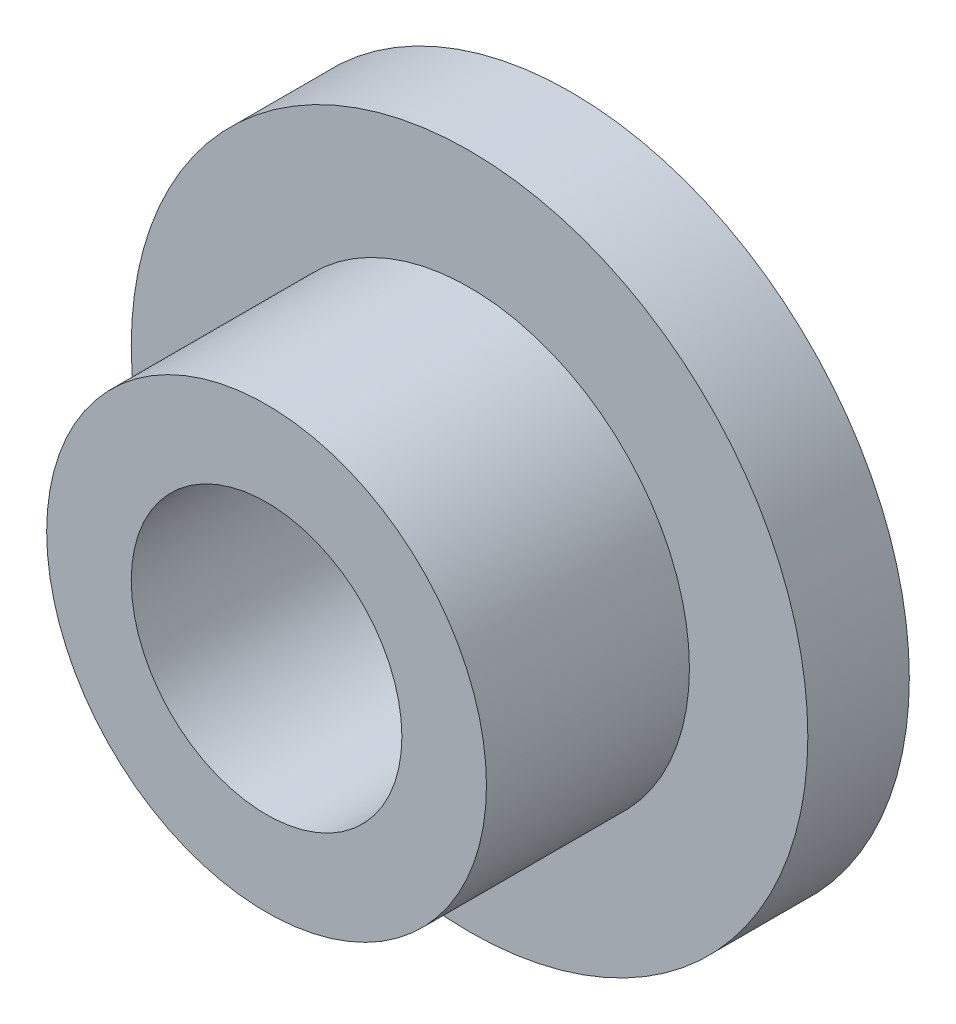
ISO-10303-21;
HEADER;
FILE_DESCRIPTION(('STEP AP214'),'2;1');
FILE_NAME('part.step','',(''),(''),'','','');
FILE_SCHEMA(('AUTOMOTIVE_DESIGN { 1 0 10303 214 1 1 1 1 }'));
ENDSEC;
DATA;
#1=APPLICATION_CONTEXT('core data for automotive mechanical design processes');
#2=APPLICATION_PROTOCOL_DEFINITION('international standard','automotive_design',2000,#1);
#3=PRODUCT_CONTEXT('',#1,'mechanical');
#4=PRODUCT('Part','Part','',(#3));
#5=PRODUCT_RELATED_PRODUCT_CATEGORY('part','',(#4));
#6=PRODUCT_DEFINITION_FORMATION('','',#4);
#7=PRODUCT_DEFINITION_CONTEXT('part definition',#1,'design');
#8=PRODUCT_DEFINITION('design','',#6,#7);
#9=PRODUCT_DEFINITION_SHAPE('','',#8);
#10=(LENGTH_UNIT() NAMED_UNIT(*) SI_UNIT(.MILLI.,.METRE.));
#11=(NAMED_UNIT(*) PLANE_ANGLE_UNIT() SI_UNIT($,.RADIAN.));
#12=(NAMED_UNIT(*) SI_UNIT($,.STERADIAN.) SOLID_ANGLE_UNIT());
#13=UNCERTAINTY_MEASURE_WITH_UNIT(LENGTH_MEASURE(1.E-05),#10,'distance_accuracy_value','');
#14=(GEOMETRIC_REPRESENTATION_CONTEXT(3) GLOBAL_UNCERTAINTY_ASSIGNED_CONTEXT((#13)) GLOBAL_UNIT_ASSIGNED_CONTEXT((#10,
#11,#12)) REPRESENTATION_CONTEXT('',''));
#15=CARTESIAN_POINT('',(0.,0.,0.));
#16=DIRECTION('',(0.,0.,1.));
#17=DIRECTION('',(1.,0.,0.));
#18=AXIS2_PLACEMENT_3D('',#15,#16,#17);
#19=CARTESIAN_POINT('',(-25.8191735710848,38.9768502607631,1.2));
#20=DIRECTION('',(0.,0.,1.));
#21=DIRECTION('',(1.,0.,0.));
#22=AXIS2_PLACEMENT_3D('',#19,#20,#21);
#23=PLANE('',#22);
#24=CARTESIAN_POINT('',(-25.8191735710848,38.9768502607631,1.2));
#25=DIRECTION('',(0.,0.,1.));
#26=DIRECTION('',(1.,0.,0.));
#27=AXIS2_PLACEMENT_3D('',#24,#25,#26);
#28=CIRCLE('',#27,1.29999999999999);
#29=CARTESIAN_POINT('',(-24.5191735710848,38.9768502607631,1.2));
#30=VERTEX_POINT('',#29);
#31=EDGE_CURVE('E10',#30,#30,#28,.T.);
#32=ORIENTED_EDGE('',*,*,#31,.T.);
#33=EDGE_LOOP('',(#32));
#34=FACE_BOUND('',#33,.T.);
#35=CARTESIAN_POINT('',(-25.8191735710848,38.9768502607631,1.2));
#36=DIRECTION('',(0.,0.,1.));
#37=DIRECTION('',(1.,0.,0.));
#38=AXIS2_PLACEMENT_3D('',#35,#36,#37);
#39=CIRCLE('',#38,0.8);
#40=CARTESIAN_POINT('',(-25.0191735710848,38.9768502607631,1.2));
#41=VERTEX_POINT('',#40);
#42=EDGE_CURVE('E45',#41,#41,#39,.T.);
#43=ORIENTED_EDGE('',*,*,#42,.F.);
#44=EDGE_LOOP('',(#43));
#45=FACE_BOUND('',#44,.T.);
#46=ADVANCED_FACE('F37',(#34,#45),#23,.T.);
#47=CARTESIAN_POINT('',(-25.8191735710848,38.9768502607631,1.2));
#48=DIRECTION('',(0.,0.,-1.));
#49=DIRECTION('',(-1.,0.,0.));
#50=AXIS2_PLACEMENT_3D('',#47,#48,#49);
#51=CYLINDRICAL_SURFACE('',#50,1.29999999999999);
#52=ORIENTED_EDGE('',*,*,#31,.F.);
#53=EDGE_LOOP('',(#52));
#54=FACE_BOUND('',#53,.T.);
#55=CARTESIAN_POINT('',(-25.8191735710848,38.9768502607631,0.));
#56=DIRECTION('',(0.,0.,1.));
#57=DIRECTION('',(1.,0.,0.));
#58=AXIS2_PLACEMENT_3D('',#55,#56,#57);
#59=CIRCLE('',#58,1.29999999999999);
#60=CARTESIAN_POINT('',(-24.5191735710848,38.9768502607631,0.));
#61=VERTEX_POINT('',#60);
#62=EDGE_CURVE('E41',#61,#61,#59,.T.);
#63=ORIENTED_EDGE('',*,*,#62,.T.);
#64=EDGE_LOOP('',(#63));
#65=FACE_BOUND('',#64,.T.);
#66=ADVANCED_FACE('F39',(#54,#65),#51,.T.);
#67=CARTESIAN_POINT('',(-25.8191735710848,38.9768502607631,1.2));
#68=DIRECTION('',(0.,0.,-1.));
#69=DIRECTION('',(-1.,0.,0.));
#70=AXIS2_PLACEMENT_3D('',#67,#68,#69);
#71=CYLINDRICAL_SURFACE('',#70,0.8);
#72=ORIENTED_EDGE('',*,*,#42,.T.);
#73=EDGE_LOOP('',(#72));
#74=FACE_BOUND('',#73,.T.);
#75=CARTESIAN_POINT('',(-25.8191735710848,38.9768502607631,-0.6));
#76=DIRECTION('',(0.,0.,-1.));
#77=DIRECTION('',(-1.,0.,0.));
#78=AXIS2_PLACEMENT_3D('',#75,#76,#77);
#79=CIRCLE('',#78,0.800000000000003);
#80=CARTESIAN_POINT('',(-26.6191735710848,38.9768502607631,-0.6));
#81=VERTEX_POINT('',#80);
#82=EDGE_CURVE('E55',#81,#81,#79,.T.);
#83=ORIENTED_EDGE('',*,*,#82,.T.);
#84=EDGE_LOOP('',(#83));
#85=FACE_BOUND('',#84,.T.);
#86=ADVANCED_FACE('F61',(#74,#85),#71,.F.);
#87=CARTESIAN_POINT('',(-25.8191735710848,38.9768502607631,-0.6));
#88=DIRECTION('',(0.,0.,-1.));
#89=DIRECTION('',(-1.,0.,0.));
#90=AXIS2_PLACEMENT_3D('',#87,#88,#89);
#91=PLANE('',#90);
#92=CARTESIAN_POINT('',(-25.8191735710848,38.9768502607631,-0.6));
#93=DIRECTION('',(0.,0.,-1.));
#94=DIRECTION('',(-1.,0.,0.));
#95=AXIS2_PLACEMENT_3D('',#92,#93,#94);
#96=CIRCLE('',#95,2.);
#97=CARTESIAN_POINT('',(-27.8191735710848,38.9768502607631,-0.6));
#98=VERTEX_POINT('',#97);
#99=EDGE_CURVE('E54',#98,#98,#96,.T.);
#100=ORIENTED_EDGE('',*,*,#99,.T.);
#101=EDGE_LOOP('',(#100));
#102=FACE_BOUND('',#101,.T.);
#103=ORIENTED_EDGE('',*,*,#82,.F.);
#104=EDGE_LOOP('',(#103));
#105=FACE_BOUND('',#104,.T.);
#106=ADVANCED_FACE('F63',(#102,#105),#91,.T.);
#107=CARTESIAN_POINT('',(-25.8191735710848,38.9768502607631,0.));
#108=DIRECTION('',(0.,0.,-1.));
#109=DIRECTION('',(-1.,0.,0.));
#110=AXIS2_PLACEMENT_3D('',#107,#108,#109);
#111=PLANE('',#110);
#112=ORIENTED_EDGE('',*,*,#62,.F.);
#113=EDGE_LOOP('',(#112));
#114=FACE_BOUND('',#113,.T.);
#115=CARTESIAN_POINT('',(-25.8191735710848,38.9768502607631,0.));
#116=DIRECTION('',(0.,0.,-1.));
#117=DIRECTION('',(-1.,0.,0.));
#118=AXIS2_PLACEMENT_3D('',#115,#116,#117);
#119=CIRCLE('',#118,2.);
#120=CARTESIAN_POINT('',(-27.8191735710848,38.9768502607631,0.));
#121=VERTEX_POINT('',#120);
#122=EDGE_CURVE('E51',#121,#121,#119,.T.);
#123=ORIENTED_EDGE('',*,*,#122,.F.);
#124=EDGE_LOOP('',(#123));
#125=FACE_BOUND('',#124,.T.);
#126=ADVANCED_FACE('F65',(#114,#125),#111,.F.);
#127=CARTESIAN_POINT('',(-25.8191735710848,38.9768502607631,-0.6));
#128=DIRECTION('',(0.,0.,1.));
#129=DIRECTION('',(1.,0.,0.));
#130=AXIS2_PLACEMENT_3D('',#127,#128,#129);
#131=CYLINDRICAL_SURFACE('',#130,2.);
#132=ORIENTED_EDGE('',*,*,#99,.F.);
#133=EDGE_LOOP('',(#132));
#134=FACE_BOUND('',#133,.T.);
#135=ORIENTED_EDGE('',*,*,#122,.T.);
#136=EDGE_LOOP('',(#135));
#137=FACE_BOUND('',#136,.T.);
#138=ADVANCED_FACE('F72',(#134,#137),#131,.T.);
#139=CLOSED_SHELL('',(#46,#66,#86,#106,#126,#138));
#140=MANIFOLD_SOLID_BREP('B2',#139);
#141=ADVANCED_BREP_SHAPE_REPRESENTATION('',(#18,#140),#14);
#142=SHAPE_DEFINITION_REPRESENTATION(#9,#141);
ENDSEC;
END-ISO-10303-21;
